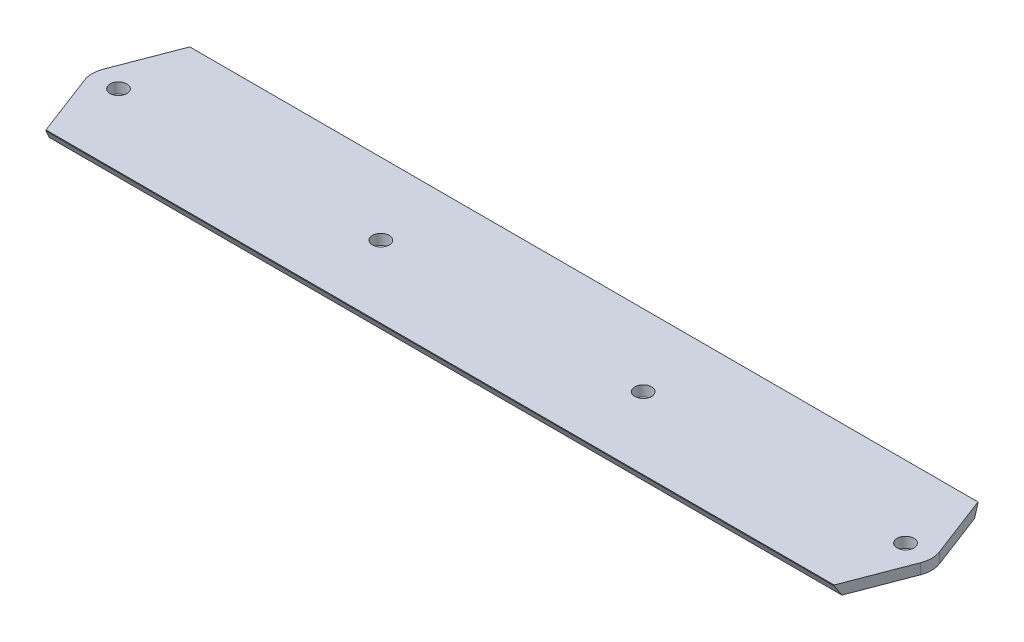
ISO-10303-21;
HEADER;
FILE_DESCRIPTION(('STEP AP214'),'2;1');
FILE_NAME('part.step','',(''),(''),'','','');
FILE_SCHEMA(('AUTOMOTIVE_DESIGN { 1 0 10303 214 1 1 1 1 }'));
ENDSEC;
DATA;
#1=APPLICATION_CONTEXT('core data for automotive mechanical design processes');
#2=APPLICATION_PROTOCOL_DEFINITION('international standard','automotive_design',2000,#1);
#3=PRODUCT_CONTEXT('',#1,'mechanical');
#4=PRODUCT('Part','Part','',(#3));
#5=PRODUCT_RELATED_PRODUCT_CATEGORY('part','',(#4));
#6=PRODUCT_DEFINITION_FORMATION('','',#4);
#7=PRODUCT_DEFINITION_CONTEXT('part definition',#1,'design');
#8=PRODUCT_DEFINITION('design','',#6,#7);
#9=PRODUCT_DEFINITION_SHAPE('','',#8);
#10=(LENGTH_UNIT() NAMED_UNIT(*) SI_UNIT(.MILLI.,.METRE.));
#11=(NAMED_UNIT(*) PLANE_ANGLE_UNIT() SI_UNIT($,.RADIAN.));
#12=(NAMED_UNIT(*) SI_UNIT($,.STERADIAN.) SOLID_ANGLE_UNIT());
#13=UNCERTAINTY_MEASURE_WITH_UNIT(LENGTH_MEASURE(1.E-05),#10,'distance_accuracy_value','');
#14=(GEOMETRIC_REPRESENTATION_CONTEXT(3) GLOBAL_UNCERTAINTY_ASSIGNED_CONTEXT((#13)) GLOBAL_UNIT_ASSIGNED_CONTEXT((#10,
#11,#12)) REPRESENTATION_CONTEXT('',''));
#15=CARTESIAN_POINT('',(0.,0.,0.));
#16=DIRECTION('',(0.,0.,1.));
#17=DIRECTION('',(1.,0.,0.));
#18=AXIS2_PLACEMENT_3D('',#15,#16,#17);
#19=CARTESIAN_POINT('',(-70.103922337467,2.,-26.8049046504249));
#20=DIRECTION('',(0.934049773615858,0.,0.357142857142858));
#21=DIRECTION('',(0.357142857142859,0.,-0.934049773615858));
#22=AXIS2_PLACEMENT_3D('',#19,#20,#21);
#23=PLANE('',#22);
#24=DIRECTION('',(-0.357142857142859,0.,0.934049773615858));
#25=VECTOR('',#24,1.);
#26=CARTESIAN_POINT('',(-70.103922337467,2.,-26.8049046504249));
#27=LINE('',#26,#25);
#28=CARTESIAN_POINT('',(-75.1147078669353,2.,-13.7));
#29=VERTEX_POINT('',#28);
#30=CARTESIAN_POINT('',(-79.6702488680793,2.,-1.78571428571429));
#31=VERTEX_POINT('',#30);
#32=EDGE_CURVE('E234',#29,#31,#27,.T.);
#33=ORIENTED_EDGE('',*,*,#32,.F.);
#34=DIRECTION('',(0.,-1.,0.));
#35=VECTOR('',#34,1.);
#36=CARTESIAN_POINT('',(-75.1147078669353,2.00000000000008,-13.7));
#37=LINE('',#36,#35);
#38=CARTESIAN_POINT('',(-75.1147078669353,1.82679491924306,-13.7));
#39=VERTEX_POINT('',#38);
#40=EDGE_CURVE('E192',#29,#39,#37,.T.);
#41=ORIENTED_EDGE('',*,*,#40,.T.);
#42=DIRECTION('',(-0.187778941547173,-0.850619951466906,0.491105657957493));
#43=VECTOR('',#42,1.);
#44=CARTESIAN_POINT('',(-73.7018319726874,8.22698236673691,-17.3951499456747));
#45=LINE('',#44,#43);
#46=CARTESIAN_POINT('',(-75.5179826969785,0.,-12.6452994616207));
#47=VERTEX_POINT('',#46);
#48=EDGE_CURVE('E243',#39,#47,#45,.T.);
#49=ORIENTED_EDGE('',*,*,#48,.T.);
#50=DIRECTION('',(-0.357142857142859,0.,0.934049773615858));
#51=VECTOR('',#50,1.);
#52=CARTESIAN_POINT('',(-70.103922337467,0.,-26.8049046504249));
#53=LINE('',#52,#51);
#54=CARTESIAN_POINT('',(-79.6702488680793,0.,-1.78571428571429));
#55=VERTEX_POINT('',#54);
#56=EDGE_CURVE('E250',#47,#55,#53,.T.);
#57=ORIENTED_EDGE('',*,*,#56,.T.);
#58=DIRECTION('',(0.,-1.,0.));
#59=VECTOR('',#58,1.);
#60=CARTESIAN_POINT('',(-79.6702488680793,2.,-1.78571428571429));
#61=LINE('',#60,#59);
#62=EDGE_CURVE('E182',#31,#55,#61,.T.);
#63=ORIENTED_EDGE('',*,*,#62,.F.);
#64=EDGE_LOOP('',(#33,#41,#49,#57,#63));
#65=FACE_BOUND('',#64,.T.);
#66=ADVANCED_FACE('F41',(#65),#23,.F.);
#67=CARTESIAN_POINT('',(-75.,2.,0.));
#68=DIRECTION('',(0.,-1.,0.));
#69=DIRECTION('',(0.,0.,-1.));
#70=AXIS2_PLACEMENT_3D('',#67,#68,#69);
#71=CYLINDRICAL_SURFACE('',#70,4.99999999999998);
#72=CARTESIAN_POINT('',(-75.,0.,0.));
#73=DIRECTION('',(0.,1.,0.));
#74=DIRECTION('',(0.,0.,1.));
#75=AXIS2_PLACEMENT_3D('',#72,#73,#74);
#76=CIRCLE('',#75,4.99999999999998);
#77=CARTESIAN_POINT('',(-79.6702488680793,0.,1.78571428571427));
#78=VERTEX_POINT('',#77);
#79=EDGE_CURVE('E151',#55,#78,#76,.T.);
#80=ORIENTED_EDGE('',*,*,#79,.T.);
#81=DIRECTION('',(0.,-1.,0.));
#82=VECTOR('',#81,1.);
#83=CARTESIAN_POINT('',(-79.6702488680793,2.,1.78571428571427));
#84=LINE('',#83,#82);
#85=CARTESIAN_POINT('',(-79.6702488680793,2.,1.78571428571427));
#86=VERTEX_POINT('',#85);
#87=EDGE_CURVE('E178',#86,#78,#84,.T.);
#88=ORIENTED_EDGE('',*,*,#87,.F.);
#89=CARTESIAN_POINT('',(-75.,2.,0.));
#90=DIRECTION('',(0.,1.,0.));
#91=DIRECTION('',(0.,0.,1.));
#92=AXIS2_PLACEMENT_3D('',#89,#90,#91);
#93=CIRCLE('',#92,4.99999999999998);
#94=EDGE_CURVE('E230',#31,#86,#93,.T.);
#95=ORIENTED_EDGE('',*,*,#94,.F.);
#96=ORIENTED_EDGE('',*,*,#62,.T.);
#97=EDGE_LOOP('',(#80,#88,#95,#96));
#98=FACE_BOUND('',#97,.T.);
#99=ADVANCED_FACE('F257',(#98),#71,.T.);
#100=CARTESIAN_POINT('',(-70.1039223374669,2.,26.8049046504249));
#101=DIRECTION('',(-0.934049773615858,0.,0.35714285714286));
#102=DIRECTION('',(0.35714285714286,0.,0.934049773615858));
#103=AXIS2_PLACEMENT_3D('',#100,#101,#102);
#104=PLANE('',#103);
#105=DIRECTION('',(-0.18777894154717,-0.850619951466912,-0.491105657957483));
#106=VECTOR('',#105,1.);
#107=CARTESIAN_POINT('',(-73.7018319726875,8.22698236673692,17.3951499456745));
#108=LINE('',#107,#106);
#109=CARTESIAN_POINT('',(-75.1147078669353,1.82679491924328,13.7));
#110=VERTEX_POINT('',#109);
#111=CARTESIAN_POINT('',(-75.5179826969785,0.,12.6452994616207));
#112=VERTEX_POINT('',#111);
#113=EDGE_CURVE('E128',#110,#112,#108,.T.);
#114=ORIENTED_EDGE('',*,*,#113,.F.);
#115=DIRECTION('',(0.,1.,0.));
#116=VECTOR('',#115,1.);
#117=CARTESIAN_POINT('',(-75.1147078669353,1.99999999999996,13.7));
#118=LINE('',#117,#116);
#119=CARTESIAN_POINT('',(-75.1147078669353,2.,13.7));
#120=VERTEX_POINT('',#119);
#121=EDGE_CURVE('E64',#110,#120,#118,.T.);
#122=ORIENTED_EDGE('',*,*,#121,.T.);
#123=DIRECTION('',(-0.35714285714286,0.,-0.934049773615858));
#124=VECTOR('',#123,1.);
#125=CARTESIAN_POINT('',(-70.1039223374669,2.,26.8049046504249));
#126=LINE('',#125,#124);
#127=EDGE_CURVE('E227',#120,#86,#126,.T.);
#128=ORIENTED_EDGE('',*,*,#127,.T.);
#129=ORIENTED_EDGE('',*,*,#87,.T.);
#130=DIRECTION('',(-0.35714285714286,0.,-0.934049773615858));
#131=VECTOR('',#130,1.);
#132=CARTESIAN_POINT('',(-70.1039223374669,0.,26.8049046504249));
#133=LINE('',#132,#131);
#134=EDGE_CURVE('E145',#112,#78,#133,.T.);
#135=ORIENTED_EDGE('',*,*,#134,.F.);
#136=EDGE_LOOP('',(#114,#122,#128,#129,#135));
#137=FACE_BOUND('',#136,.T.);
#138=ADVANCED_FACE('F261',(#137),#104,.T.);
#139=CARTESIAN_POINT('',(70.1039223374671,2.,26.8049046504246));
#140=DIRECTION('',(-0.934049773615859,0.,-0.357142857142855));
#141=DIRECTION('',(-0.357142857142855,0.,0.934049773615859));
#142=AXIS2_PLACEMENT_3D('',#139,#140,#141);
#143=PLANE('',#142);
#144=DIRECTION('',(0.357142857142855,0.,-0.934049773615859));
#145=VECTOR('',#144,1.);
#146=CARTESIAN_POINT('',(70.1039223374671,2.,26.8049046504246));
#147=LINE('',#146,#145);
#148=CARTESIAN_POINT('',(75.1147078669353,2.,13.7));
#149=VERTEX_POINT('',#148);
#150=CARTESIAN_POINT('',(79.6702488680794,2.,1.78571428571398));
#151=VERTEX_POINT('',#150);
#152=EDGE_CURVE('E224',#149,#151,#147,.T.);
#153=ORIENTED_EDGE('',*,*,#152,.F.);
#154=DIRECTION('',(0.,-1.,0.));
#155=VECTOR('',#154,1.);
#156=CARTESIAN_POINT('',(75.1147078669353,1.82679491924329,13.7));
#157=LINE('',#156,#155);
#158=CARTESIAN_POINT('',(75.1147078669353,1.82679491924328,13.7));
#159=VERTEX_POINT('',#158);
#160=EDGE_CURVE('E11',#149,#159,#157,.T.);
#161=ORIENTED_EDGE('',*,*,#160,.T.);
#162=DIRECTION('',(0.187778941547167,-0.850619951466913,-0.491105657957483));
#163=VECTOR('',#162,1.);
#164=CARTESIAN_POINT('',(73.7018319726875,8.22698236673676,17.3951499456744));
#165=LINE('',#164,#163);
#166=CARTESIAN_POINT('',(75.5179826969786,1.53523027623947E-13,12.6452994616207));
#167=VERTEX_POINT('',#166);
#168=EDGE_CURVE('E116',#159,#167,#165,.T.);
#169=ORIENTED_EDGE('',*,*,#168,.T.);
#170=DIRECTION('',(0.357142857142855,0.,-0.934049773615859));
#171=VECTOR('',#170,1.);
#172=CARTESIAN_POINT('',(70.1039223374671,0.,26.8049046504246));
#173=LINE('',#172,#171);
#174=CARTESIAN_POINT('',(79.6702488680794,0.,1.78571428571398));
#175=VERTEX_POINT('',#174);
#176=EDGE_CURVE('E121',#167,#175,#173,.T.);
#177=ORIENTED_EDGE('',*,*,#176,.T.);
#178=DIRECTION('',(0.,-1.,0.));
#179=VECTOR('',#178,1.);
#180=CARTESIAN_POINT('',(79.6702488680794,2.,1.78571428571398));
#181=LINE('',#180,#179);
#182=EDGE_CURVE('E174',#151,#175,#181,.T.);
#183=ORIENTED_EDGE('',*,*,#182,.F.);
#184=EDGE_LOOP('',(#153,#161,#169,#177,#183));
#185=FACE_BOUND('',#184,.T.);
#186=ADVANCED_FACE('F118',(#185),#143,.F.);
#187=CARTESIAN_POINT('',(75.,2.,-3.2612801348364E-13));
#188=DIRECTION('',(0.,-1.,0.));
#189=DIRECTION('',(0.,0.,-1.));
#190=AXIS2_PLACEMENT_3D('',#187,#188,#189);
#191=CYLINDRICAL_SURFACE('',#190,5.00000000000006);
#192=CARTESIAN_POINT('',(75.,0.,-3.2612801348364E-13));
#193=DIRECTION('',(0.,1.,0.));
#194=DIRECTION('',(0.,0.,1.));
#195=AXIS2_PLACEMENT_3D('',#192,#193,#194);
#196=CIRCLE('',#195,5.00000000000006);
#197=CARTESIAN_POINT('',(79.6702488680794,0.,-1.7857142857146));
#198=VERTEX_POINT('',#197);
#199=EDGE_CURVE('E143',#198,#175,#196,.F.);
#200=ORIENTED_EDGE('',*,*,#199,.F.);
#201=DIRECTION('',(0.,-1.,0.));
#202=VECTOR('',#201,1.);
#203=CARTESIAN_POINT('',(79.6702488680794,2.,-1.7857142857146));
#204=LINE('',#203,#202);
#205=CARTESIAN_POINT('',(79.6702488680794,2.,-1.7857142857146));
#206=VERTEX_POINT('',#205);
#207=EDGE_CURVE('E170',#206,#198,#204,.T.);
#208=ORIENTED_EDGE('',*,*,#207,.F.);
#209=CARTESIAN_POINT('',(75.,2.,-3.2612801348364E-13));
#210=DIRECTION('',(0.,1.,0.));
#211=DIRECTION('',(0.,0.,1.));
#212=AXIS2_PLACEMENT_3D('',#209,#210,#211);
#213=CIRCLE('',#212,5.00000000000006);
#214=EDGE_CURVE('E220',#206,#151,#213,.F.);
#215=ORIENTED_EDGE('',*,*,#214,.T.);
#216=ORIENTED_EDGE('',*,*,#182,.T.);
#217=EDGE_LOOP('',(#200,#208,#215,#216));
#218=FACE_BOUND('',#217,.T.);
#219=ADVANCED_FACE('F282',(#218),#191,.T.);
#220=CARTESIAN_POINT('',(-25.,2.,-1.11022302462516E-13));
#221=DIRECTION('',(0.,-1.,0.));
#222=DIRECTION('',(0.,0.,-1.));
#223=AXIS2_PLACEMENT_3D('',#220,#221,#222);
#224=CYLINDRICAL_SURFACE('',#223,1.6);
#225=CARTESIAN_POINT('',(-25.,2.,-1.11022302462516E-13));
#226=DIRECTION('',(0.,1.,0.));
#227=DIRECTION('',(0.,0.,1.));
#228=AXIS2_PLACEMENT_3D('',#225,#226,#227);
#229=CIRCLE('',#228,1.6);
#230=CARTESIAN_POINT('',(-25.,2.,1.59999999999989));
#231=VERTEX_POINT('',#230);
#232=EDGE_CURVE('E209',#231,#231,#229,.T.);
#233=ORIENTED_EDGE('',*,*,#232,.T.);
#234=EDGE_LOOP('',(#233));
#235=FACE_BOUND('',#234,.T.);
#236=CARTESIAN_POINT('',(-25.,0.,-1.11022302462516E-13));
#237=DIRECTION('',(0.,1.,0.));
#238=DIRECTION('',(0.,0.,1.));
#239=AXIS2_PLACEMENT_3D('',#236,#237,#238);
#240=CIRCLE('',#239,1.6);
#241=CARTESIAN_POINT('',(-25.,0.,1.59999999999989));
#242=VERTEX_POINT('',#241);
#243=EDGE_CURVE('E161',#242,#242,#240,.T.);
#244=ORIENTED_EDGE('',*,*,#243,.F.);
#245=EDGE_LOOP('',(#244));
#246=FACE_BOUND('',#245,.T.);
#247=ADVANCED_FACE('F325',(#235,#246),#224,.F.);
#248=CARTESIAN_POINT('',(25.,2.,-2.1163626406917E-13));
#249=DIRECTION('',(0.,-1.,0.));
#250=DIRECTION('',(0.,0.,-1.));
#251=AXIS2_PLACEMENT_3D('',#248,#249,#250);
#252=CYLINDRICAL_SURFACE('',#251,1.6);
#253=CARTESIAN_POINT('',(25.,2.,-2.1163626406917E-13));
#254=DIRECTION('',(0.,1.,0.));
#255=DIRECTION('',(0.,0.,1.));
#256=AXIS2_PLACEMENT_3D('',#253,#254,#255);
#257=CIRCLE('',#256,1.6);
#258=CARTESIAN_POINT('',(25.,2.,1.59999999999979));
#259=VERTEX_POINT('',#258);
#260=EDGE_CURVE('E213',#259,#259,#257,.T.);
#261=ORIENTED_EDGE('',*,*,#260,.T.);
#262=EDGE_LOOP('',(#261));
#263=FACE_BOUND('',#262,.T.);
#264=CARTESIAN_POINT('',(25.,0.,-2.1163626406917E-13));
#265=DIRECTION('',(0.,1.,0.));
#266=DIRECTION('',(0.,0.,1.));
#267=AXIS2_PLACEMENT_3D('',#264,#265,#266);
#268=CIRCLE('',#267,1.6);
#269=CARTESIAN_POINT('',(25.,0.,1.59999999999979));
#270=VERTEX_POINT('',#269);
#271=EDGE_CURVE('E157',#270,#270,#268,.T.);
#272=ORIENTED_EDGE('',*,*,#271,.F.);
#273=EDGE_LOOP('',(#272));
#274=FACE_BOUND('',#273,.T.);
#275=ADVANCED_FACE('F311',(#263,#274),#252,.F.);
#276=CARTESIAN_POINT('',(70.1039223374665,2.,-26.8049046504257));
#277=DIRECTION('',(0.934049773615854,0.,-0.35714285714287));
#278=DIRECTION('',(-0.35714285714287,0.,-0.934049773615854));
#279=AXIS2_PLACEMENT_3D('',#276,#277,#278);
#280=PLANE('',#279);
#281=DIRECTION('',(0.18777894154718,-0.850619951466905,0.491105657957492));
#282=VECTOR('',#281,1.);
#283=CARTESIAN_POINT('',(73.7018319726873,8.22698236673733,-17.3951499456749));
#284=LINE('',#283,#282);
#285=CARTESIAN_POINT('',(75.1147078669353,1.82679491924306,-13.7));
#286=VERTEX_POINT('',#285);
#287=CARTESIAN_POINT('',(75.5179826969786,0.,-12.6452994616208));
#288=VERTEX_POINT('',#287);
#289=EDGE_CURVE('E272',#286,#288,#284,.T.);
#290=ORIENTED_EDGE('',*,*,#289,.F.);
#291=DIRECTION('',(0.,1.,0.));
#292=VECTOR('',#291,1.);
#293=CARTESIAN_POINT('',(75.1147078669353,2.00000000000004,-13.7));
#294=LINE('',#293,#292);
#295=CARTESIAN_POINT('',(75.1147078669353,2.,-13.7));
#296=VERTEX_POINT('',#295);
#297=EDGE_CURVE('E198',#286,#296,#294,.T.);
#298=ORIENTED_EDGE('',*,*,#297,.T.);
#299=DIRECTION('',(0.35714285714287,0.,0.934049773615854));
#300=VECTOR('',#299,1.);
#301=CARTESIAN_POINT('',(70.1039223374665,2.,-26.8049046504257));
#302=LINE('',#301,#300);
#303=EDGE_CURVE('E217',#296,#206,#302,.T.);
#304=ORIENTED_EDGE('',*,*,#303,.T.);
#305=ORIENTED_EDGE('',*,*,#207,.T.);
#306=DIRECTION('',(0.35714285714287,0.,0.934049773615854));
#307=VECTOR('',#306,1.);
#308=CARTESIAN_POINT('',(70.1039223374665,0.,-26.8049046504257));
#309=LINE('',#308,#307);
#310=EDGE_CURVE('E149',#288,#198,#309,.T.);
#311=ORIENTED_EDGE('',*,*,#310,.F.);
#312=EDGE_LOOP('',(#290,#298,#304,#305,#311));
#313=FACE_BOUND('',#312,.T.);
#314=ADVANCED_FACE('F277',(#313),#280,.T.);
#315=CARTESIAN_POINT('',(75.,2.,-3.2612801348364E-13));
#316=DIRECTION('',(0.,-1.,0.));
#317=DIRECTION('',(0.,0.,-1.));
#318=AXIS2_PLACEMENT_3D('',#315,#316,#317);
#319=CYLINDRICAL_SURFACE('',#318,1.60000000000001);
#320=CARTESIAN_POINT('',(75.,2.,-3.2612801348364E-13));
#321=DIRECTION('',(0.,1.,0.));
#322=DIRECTION('',(0.,0.,1.));
#323=AXIS2_PLACEMENT_3D('',#320,#321,#322);
#324=CIRCLE('',#323,1.60000000000001);
#325=CARTESIAN_POINT('',(75.,2.,1.59999999999968));
#326=VERTEX_POINT('',#325);
#327=EDGE_CURVE('E169',#326,#326,#324,.F.);
#328=ORIENTED_EDGE('',*,*,#327,.F.);
#329=EDGE_LOOP('',(#328));
#330=FACE_BOUND('',#329,.T.);
#331=CARTESIAN_POINT('',(75.,0.,-3.2612801348364E-13));
#332=DIRECTION('',(0.,1.,0.));
#333=DIRECTION('',(0.,0.,1.));
#334=AXIS2_PLACEMENT_3D('',#331,#332,#333);
#335=CIRCLE('',#334,1.60000000000001);
#336=CARTESIAN_POINT('',(75.,0.,1.59999999999968));
#337=VERTEX_POINT('',#336);
#338=EDGE_CURVE('E246',#337,#337,#335,.F.);
#339=ORIENTED_EDGE('',*,*,#338,.T.);
#340=EDGE_LOOP('',(#339));
#341=FACE_BOUND('',#340,.T.);
#342=ADVANCED_FACE('F301',(#330,#341),#319,.F.);
#343=CARTESIAN_POINT('',(-75.,2.,0.));
#344=DIRECTION('',(0.,-1.,0.));
#345=DIRECTION('',(0.,0.,-1.));
#346=AXIS2_PLACEMENT_3D('',#343,#344,#345);
#347=CYLINDRICAL_SURFACE('',#346,1.60000000000001);
#348=CARTESIAN_POINT('',(-75.,2.,0.));
#349=DIRECTION('',(0.,1.,0.));
#350=DIRECTION('',(0.,0.,1.));
#351=AXIS2_PLACEMENT_3D('',#348,#349,#350);
#352=CIRCLE('',#351,1.60000000000001);
#353=CARTESIAN_POINT('',(-75.,2.,1.6));
#354=VERTEX_POINT('',#353);
#355=EDGE_CURVE('E175',#354,#354,#352,.T.);
#356=ORIENTED_EDGE('',*,*,#355,.T.);
#357=EDGE_LOOP('',(#356));
#358=FACE_BOUND('',#357,.T.);
#359=CARTESIAN_POINT('',(-75.,0.,0.));
#360=DIRECTION('',(0.,1.,0.));
#361=DIRECTION('',(0.,0.,1.));
#362=AXIS2_PLACEMENT_3D('',#359,#360,#361);
#363=CIRCLE('',#362,1.60000000000001);
#364=CARTESIAN_POINT('',(-75.,0.,1.6));
#365=VERTEX_POINT('',#364);
#366=EDGE_CURVE('E165',#365,#365,#363,.T.);
#367=ORIENTED_EDGE('',*,*,#366,.F.);
#368=EDGE_LOOP('',(#367));
#369=FACE_BOUND('',#368,.T.);
#370=ADVANCED_FACE('F303',(#358,#369),#347,.F.);
#371=CARTESIAN_POINT('',(0.,2.,0.));
#372=DIRECTION('',(0.,1.,0.));
#373=DIRECTION('',(0.,0.,1.));
#374=AXIS2_PLACEMENT_3D('',#371,#372,#373);
#375=PLANE('',#374);
#376=ORIENTED_EDGE('',*,*,#127,.F.);
#377=DIRECTION('',(1.,0.,0.));
#378=VECTOR('',#377,1.);
#379=CARTESIAN_POINT('',(75.0764719112902,2.,13.7));
#380=LINE('',#379,#378);
#381=EDGE_CURVE('E50',#120,#149,#380,.T.);
#382=ORIENTED_EDGE('',*,*,#381,.T.);
#383=ORIENTED_EDGE('',*,*,#152,.T.);
#384=ORIENTED_EDGE('',*,*,#214,.F.);
#385=ORIENTED_EDGE('',*,*,#303,.F.);
#386=DIRECTION('',(-1.,0.,0.));
#387=VECTOR('',#386,1.);
#388=CARTESIAN_POINT('',(-75.0764719112902,2.,-13.7));
#389=LINE('',#388,#387);
#390=EDGE_CURVE('E136',#296,#29,#389,.T.);
#391=ORIENTED_EDGE('',*,*,#390,.T.);
#392=ORIENTED_EDGE('',*,*,#32,.T.);
#393=ORIENTED_EDGE('',*,*,#94,.T.);
#394=EDGE_LOOP('',(#376,#382,#383,#384,#385,#391,#392,#393));
#395=FACE_BOUND('',#394,.T.);
#396=ORIENTED_EDGE('',*,*,#327,.T.);
#397=EDGE_LOOP('',(#396));
#398=FACE_BOUND('',#397,.T.);
#399=ORIENTED_EDGE('',*,*,#260,.F.);
#400=EDGE_LOOP('',(#399));
#401=FACE_BOUND('',#400,.T.);
#402=ORIENTED_EDGE('',*,*,#232,.F.);
#403=EDGE_LOOP('',(#402));
#404=FACE_BOUND('',#403,.T.);
#405=ORIENTED_EDGE('',*,*,#355,.F.);
#406=EDGE_LOOP('',(#405));
#407=FACE_BOUND('',#406,.T.);
#408=ADVANCED_FACE('F262',(#395,#398,#401,#404,#407),#375,.T.);
#409=CARTESIAN_POINT('',(0.,0.,0.));
#410=DIRECTION('',(0.,1.,0.));
#411=DIRECTION('',(0.,0.,1.));
#412=AXIS2_PLACEMENT_3D('',#409,#410,#411);
#413=PLANE('',#412);
#414=ORIENTED_EDGE('',*,*,#338,.F.);
#415=EDGE_LOOP('',(#414));
#416=FACE_BOUND('',#415,.T.);
#417=ORIENTED_EDGE('',*,*,#176,.F.);
#418=DIRECTION('',(-1.,0.,0.));
#419=VECTOR('',#418,1.);
#420=CARTESIAN_POINT('',(0.,0.,12.6452994616207));
#421=LINE('',#420,#419);
#422=EDGE_CURVE('E131',#167,#112,#421,.T.);
#423=ORIENTED_EDGE('',*,*,#422,.T.);
#424=ORIENTED_EDGE('',*,*,#134,.T.);
#425=ORIENTED_EDGE('',*,*,#79,.F.);
#426=ORIENTED_EDGE('',*,*,#56,.F.);
#427=DIRECTION('',(1.,0.,0.));
#428=VECTOR('',#427,1.);
#429=CARTESIAN_POINT('',(0.,0.,-12.6452994616207));
#430=LINE('',#429,#428);
#431=EDGE_CURVE('E137',#47,#288,#430,.T.);
#432=ORIENTED_EDGE('',*,*,#431,.T.);
#433=ORIENTED_EDGE('',*,*,#310,.T.);
#434=ORIENTED_EDGE('',*,*,#199,.T.);
#435=EDGE_LOOP('',(#417,#423,#424,#425,#426,#432,#433,#434));
#436=FACE_BOUND('',#435,.T.);
#437=ORIENTED_EDGE('',*,*,#271,.T.);
#438=EDGE_LOOP('',(#437));
#439=FACE_BOUND('',#438,.T.);
#440=ORIENTED_EDGE('',*,*,#243,.T.);
#441=EDGE_LOOP('',(#440));
#442=FACE_BOUND('',#441,.T.);
#443=ORIENTED_EDGE('',*,*,#366,.T.);
#444=EDGE_LOOP('',(#443));
#445=FACE_BOUND('',#444,.T.);
#446=ADVANCED_FACE('F140',(#416,#436,#439,#442,#445),#413,.F.);
#447=CARTESIAN_POINT('',(80.0000000000001,2.,-13.8));
#448=DIRECTION('',(0.,0.500000000000006,0.866025403784435));
#449=DIRECTION('',(0.,-0.866025403784435,0.500000000000007));
#450=AXIS2_PLACEMENT_3D('',#447,#448,#449);
#451=PLANE('',#450);
#452=ORIENTED_EDGE('',*,*,#48,.F.);
#453=DIRECTION('',(1.,0.,0.));
#454=VECTOR('',#453,1.);
#455=CARTESIAN_POINT('',(75.0764719112902,1.82679491924306,-13.7));
#456=LINE('',#455,#454);
#457=EDGE_CURVE('E195',#39,#286,#456,.T.);
#458=ORIENTED_EDGE('',*,*,#457,.T.);
#459=ORIENTED_EDGE('',*,*,#289,.T.);
#460=ORIENTED_EDGE('',*,*,#431,.F.);
#461=EDGE_LOOP('',(#452,#458,#459,#460));
#462=FACE_BOUND('',#461,.T.);
#463=ADVANCED_FACE('F273',(#462),#451,.F.);
#464=CARTESIAN_POINT('',(80.0000000000001,2.00000000000017,13.8));
#465=DIRECTION('',(0.,0.499999999999996,-0.866025403784441));
#466=DIRECTION('',(0.,0.866025403784441,0.499999999999996));
#467=AXIS2_PLACEMENT_3D('',#464,#465,#466);
#468=PLANE('',#467);
#469=ORIENTED_EDGE('',*,*,#168,.F.);
#470=DIRECTION('',(-1.,0.,0.));
#471=VECTOR('',#470,1.);
#472=CARTESIAN_POINT('',(-75.0764719112902,1.82679491924328,13.7));
#473=LINE('',#472,#471);
#474=EDGE_CURVE('E201',#159,#110,#473,.T.);
#475=ORIENTED_EDGE('',*,*,#474,.T.);
#476=ORIENTED_EDGE('',*,*,#113,.T.);
#477=ORIENTED_EDGE('',*,*,#422,.F.);
#478=EDGE_LOOP('',(#469,#475,#476,#477));
#479=FACE_BOUND('',#478,.T.);
#480=ADVANCED_FACE('F132',(#479),#468,.F.);
#481=CARTESIAN_POINT('',(0.,2.,-13.7));
#482=DIRECTION('',(0.,0.,-1.));
#483=DIRECTION('',(1.,0.,0.));
#484=AXIS2_PLACEMENT_3D('',#481,#482,#483);
#485=PLANE('',#484);
#486=ORIENTED_EDGE('',*,*,#297,.F.);
#487=ORIENTED_EDGE('',*,*,#457,.F.);
#488=ORIENTED_EDGE('',*,*,#40,.F.);
#489=ORIENTED_EDGE('',*,*,#390,.F.);
#490=EDGE_LOOP('',(#486,#487,#488,#489));
#491=FACE_BOUND('',#490,.T.);
#492=ADVANCED_FACE('F288',(#491),#485,.T.);
#493=CARTESIAN_POINT('',(80.0000000000001,1.82679491924328,13.7));
#494=DIRECTION('',(0.,0.,1.));
#495=DIRECTION('',(1.,0.,0.));
#496=AXIS2_PLACEMENT_3D('',#493,#494,#495);
#497=PLANE('',#496);
#498=ORIENTED_EDGE('',*,*,#160,.F.);
#499=ORIENTED_EDGE('',*,*,#381,.F.);
#500=ORIENTED_EDGE('',*,*,#121,.F.);
#501=ORIENTED_EDGE('',*,*,#474,.F.);
#502=EDGE_LOOP('',(#498,#499,#500,#501));
#503=FACE_BOUND('',#502,.T.);
#504=ADVANCED_FACE('F43',(#503),#497,.T.);
#505=CLOSED_SHELL('',(#66,#99,#138,#186,#219,#247,#275,#314,#342,#370,#408,#446,#463,#480,#492,#504));
#506=MANIFOLD_SOLID_BREP('B2',#505);
#507=ADVANCED_BREP_SHAPE_REPRESENTATION('',(#18,#506),#14);
#508=SHAPE_DEFINITION_REPRESENTATION(#9,#507);
ENDSEC;
END-ISO-10303-21;
